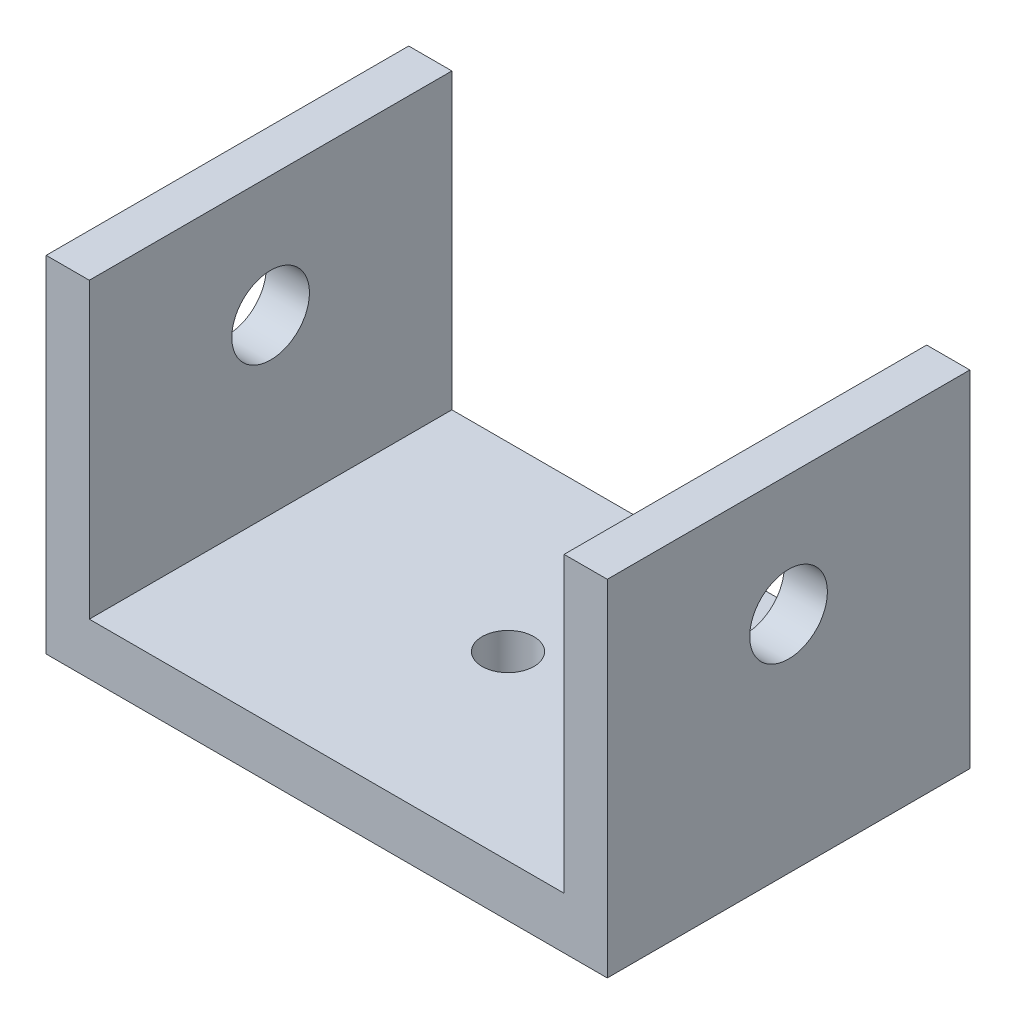
ISO-10303-21;
HEADER;
FILE_DESCRIPTION(('STEP AP214'),'2;1');
FILE_NAME('part.step','',(''),(''),'','','');
FILE_SCHEMA(('AUTOMOTIVE_DESIGN { 1 0 10303 214 1 1 1 1 }'));
ENDSEC;
DATA;
#1=APPLICATION_CONTEXT('core data for automotive mechanical design processes');
#2=APPLICATION_PROTOCOL_DEFINITION('international standard','automotive_design',2000,#1);
#3=PRODUCT_CONTEXT('',#1,'mechanical');
#4=PRODUCT('Part','Part','',(#3));
#5=PRODUCT_RELATED_PRODUCT_CATEGORY('part','',(#4));
#6=PRODUCT_DEFINITION_FORMATION('','',#4);
#7=PRODUCT_DEFINITION_CONTEXT('part definition',#1,'design');
#8=PRODUCT_DEFINITION('design','',#6,#7);
#9=PRODUCT_DEFINITION_SHAPE('','',#8);
#10=(LENGTH_UNIT() NAMED_UNIT(*) SI_UNIT(.MILLI.,.METRE.));
#11=(NAMED_UNIT(*) PLANE_ANGLE_UNIT() SI_UNIT($,.RADIAN.));
#12=(NAMED_UNIT(*) SI_UNIT($,.STERADIAN.) SOLID_ANGLE_UNIT());
#13=UNCERTAINTY_MEASURE_WITH_UNIT(LENGTH_MEASURE(1.E-05),#10,'distance_accuracy_value','');
#14=(GEOMETRIC_REPRESENTATION_CONTEXT(3) GLOBAL_UNCERTAINTY_ASSIGNED_CONTEXT((#13)) GLOBAL_UNIT_ASSIGNED_CONTEXT((#10,
#11,#12)) REPRESENTATION_CONTEXT('',''));
#15=CARTESIAN_POINT('',(0.,0.,0.));
#16=DIRECTION('',(0.,0.,1.));
#17=DIRECTION('',(1.,0.,0.));
#18=AXIS2_PLACEMENT_3D('',#15,#16,#17);
#19=CARTESIAN_POINT('',(0.,3.,-10.5));
#20=DIRECTION('',(0.,0.,-1.));
#21=DIRECTION('',(-1.,0.,0.));
#22=AXIS2_PLACEMENT_3D('',#19,#20,#21);
#23=PLANE('',#22);
#24=DIRECTION('',(1.,0.,0.));
#25=VECTOR('',#24,1.);
#26=CARTESIAN_POINT('',(0.,0.,-10.5));
#27=LINE('',#26,#25);
#28=CARTESIAN_POINT('',(-16.25,0.,-10.5));
#29=VERTEX_POINT('',#28);
#30=CARTESIAN_POINT('',(16.25,0.,-10.5));
#31=VERTEX_POINT('',#30);
#32=EDGE_CURVE('E164',#29,#31,#27,.T.);
#33=ORIENTED_EDGE('',*,*,#32,.F.);
#34=DIRECTION('',(0.,-1.,0.));
#35=VECTOR('',#34,1.);
#36=CARTESIAN_POINT('',(-16.25,20.,-10.5));
#37=LINE('',#36,#35);
#38=CARTESIAN_POINT('',(-16.25,20.,-10.5));
#39=VERTEX_POINT('',#38);
#40=EDGE_CURVE('E161',#39,#29,#37,.T.);
#41=ORIENTED_EDGE('',*,*,#40,.F.);
#42=DIRECTION('',(1.,0.,0.));
#43=VECTOR('',#42,1.);
#44=CARTESIAN_POINT('',(0.,20.,-10.5));
#45=LINE('',#44,#43);
#46=CARTESIAN_POINT('',(-13.75,20.,-10.5));
#47=VERTEX_POINT('',#46);
#48=EDGE_CURVE('E143',#39,#47,#45,.T.);
#49=ORIENTED_EDGE('',*,*,#48,.T.);
#50=DIRECTION('',(0.,-1.,0.));
#51=VECTOR('',#50,1.);
#52=CARTESIAN_POINT('',(-13.75,20.,-10.5));
#53=LINE('',#52,#51);
#54=CARTESIAN_POINT('',(-13.75,3.,-10.5));
#55=VERTEX_POINT('',#54);
#56=EDGE_CURVE('E153',#47,#55,#53,.T.);
#57=ORIENTED_EDGE('',*,*,#56,.T.);
#58=DIRECTION('',(1.,0.,0.));
#59=VECTOR('',#58,1.);
#60=CARTESIAN_POINT('',(0.,3.,-10.5));
#61=LINE('',#60,#59);
#62=CARTESIAN_POINT('',(13.75,3.,-10.5));
#63=VERTEX_POINT('',#62);
#64=EDGE_CURVE('E110',#55,#63,#61,.T.);
#65=ORIENTED_EDGE('',*,*,#64,.T.);
#66=DIRECTION('',(0.,-1.,0.));
#67=VECTOR('',#66,1.);
#68=CARTESIAN_POINT('',(13.75,20.,-10.5));
#69=LINE('',#68,#67);
#70=CARTESIAN_POINT('',(13.75,20.,-10.5));
#71=VERTEX_POINT('',#70);
#72=EDGE_CURVE('E104',#71,#63,#69,.T.);
#73=ORIENTED_EDGE('',*,*,#72,.F.);
#74=DIRECTION('',(1.,0.,0.));
#75=VECTOR('',#74,1.);
#76=CARTESIAN_POINT('',(0.,20.,-10.5));
#77=LINE('',#76,#75);
#78=CARTESIAN_POINT('',(16.25,20.,-10.5));
#79=VERTEX_POINT('',#78);
#80=EDGE_CURVE('E108',#71,#79,#77,.T.);
#81=ORIENTED_EDGE('',*,*,#80,.T.);
#82=DIRECTION('',(0.,-1.,0.));
#83=VECTOR('',#82,1.);
#84=CARTESIAN_POINT('',(16.25,20.,-10.5));
#85=LINE('',#84,#83);
#86=EDGE_CURVE('E136',#79,#31,#85,.T.);
#87=ORIENTED_EDGE('',*,*,#86,.T.);
#88=EDGE_LOOP('',(#33,#41,#49,#57,#65,#73,#81,#87));
#89=FACE_BOUND('',#88,.T.);
#90=ADVANCED_FACE('F37',(#89),#23,.T.);
#91=CARTESIAN_POINT('',(0.,3.,10.5));
#92=DIRECTION('',(0.,0.,-1.));
#93=DIRECTION('',(-1.,0.,0.));
#94=AXIS2_PLACEMENT_3D('',#91,#92,#93);
#95=PLANE('',#94);
#96=DIRECTION('',(1.,0.,0.));
#97=VECTOR('',#96,1.);
#98=CARTESIAN_POINT('',(0.,0.,10.5));
#99=LINE('',#98,#97);
#100=CARTESIAN_POINT('',(-16.25,0.,10.5));
#101=VERTEX_POINT('',#100);
#102=CARTESIAN_POINT('',(16.25,0.,10.5));
#103=VERTEX_POINT('',#102);
#104=EDGE_CURVE('E40',#101,#103,#99,.T.);
#105=ORIENTED_EDGE('',*,*,#104,.T.);
#106=DIRECTION('',(0.,-1.,0.));
#107=VECTOR('',#106,1.);
#108=CARTESIAN_POINT('',(16.25,20.,10.5));
#109=LINE('',#108,#107);
#110=CARTESIAN_POINT('',(16.25,20.,10.5));
#111=VERTEX_POINT('',#110);
#112=EDGE_CURVE('E139',#111,#103,#109,.T.);
#113=ORIENTED_EDGE('',*,*,#112,.F.);
#114=DIRECTION('',(1.,0.,0.));
#115=VECTOR('',#114,1.);
#116=CARTESIAN_POINT('',(0.,20.,10.5));
#117=LINE('',#116,#115);
#118=CARTESIAN_POINT('',(13.75,20.,10.5));
#119=VERTEX_POINT('',#118);
#120=EDGE_CURVE('E121',#119,#111,#117,.T.);
#121=ORIENTED_EDGE('',*,*,#120,.F.);
#122=DIRECTION('',(0.,-1.,0.));
#123=VECTOR('',#122,1.);
#124=CARTESIAN_POINT('',(13.75,20.,10.5));
#125=LINE('',#124,#123);
#126=CARTESIAN_POINT('',(13.75,3.,10.5));
#127=VERTEX_POINT('',#126);
#128=EDGE_CURVE('E113',#119,#127,#125,.T.);
#129=ORIENTED_EDGE('',*,*,#128,.T.);
#130=DIRECTION('',(1.,0.,0.));
#131=VECTOR('',#130,1.);
#132=CARTESIAN_POINT('',(0.,3.,10.5));
#133=LINE('',#132,#131);
#134=CARTESIAN_POINT('',(-13.75,3.,10.5));
#135=VERTEX_POINT('',#134);
#136=EDGE_CURVE('E11',#135,#127,#133,.T.);
#137=ORIENTED_EDGE('',*,*,#136,.F.);
#138=DIRECTION('',(0.,-1.,0.));
#139=VECTOR('',#138,1.);
#140=CARTESIAN_POINT('',(-13.75,20.,10.5));
#141=LINE('',#140,#139);
#142=CARTESIAN_POINT('',(-13.75,20.,10.5));
#143=VERTEX_POINT('',#142);
#144=EDGE_CURVE('E53',#143,#135,#141,.T.);
#145=ORIENTED_EDGE('',*,*,#144,.F.);
#146=DIRECTION('',(1.,0.,0.));
#147=VECTOR('',#146,1.);
#148=CARTESIAN_POINT('',(0.,20.,10.5));
#149=LINE('',#148,#147);
#150=CARTESIAN_POINT('',(-16.25,20.,10.5));
#151=VERTEX_POINT('',#150);
#152=EDGE_CURVE('E149',#151,#143,#149,.T.);
#153=ORIENTED_EDGE('',*,*,#152,.F.);
#154=DIRECTION('',(0.,-1.,0.));
#155=VECTOR('',#154,1.);
#156=CARTESIAN_POINT('',(-16.25,20.,10.5));
#157=LINE('',#156,#155);
#158=EDGE_CURVE('E158',#151,#101,#157,.T.);
#159=ORIENTED_EDGE('',*,*,#158,.T.);
#160=EDGE_LOOP('',(#105,#113,#121,#129,#137,#145,#153,#159));
#161=FACE_BOUND('',#160,.T.);
#162=ADVANCED_FACE('F171',(#161),#95,.F.);
#163=CARTESIAN_POINT('',(0.,3.,0.));
#164=DIRECTION('',(0.,1.,0.));
#165=DIRECTION('',(0.,0.,1.));
#166=AXIS2_PLACEMENT_3D('',#163,#164,#165);
#167=PLANE('',#166);
#168=CARTESIAN_POINT('',(0.,3.,0.));
#169=DIRECTION('',(0.,1.,0.));
#170=DIRECTION('',(0.,0.,1.));
#171=AXIS2_PLACEMENT_3D('',#168,#169,#170);
#172=CIRCLE('',#171,1.5);
#173=CARTESIAN_POINT('',(0.,3.,1.5));
#174=VERTEX_POINT('',#173);
#175=EDGE_CURVE('E310',#174,#174,#172,.T.);
#176=ORIENTED_EDGE('',*,*,#175,.F.);
#177=EDGE_LOOP('',(#176));
#178=FACE_BOUND('',#177,.T.);
#179=DIRECTION('',(0.,0.,1.));
#180=VECTOR('',#179,1.);
#181=CARTESIAN_POINT('',(13.75,3.,0.));
#182=LINE('',#181,#180);
#183=EDGE_CURVE('E60',#63,#127,#182,.T.);
#184=ORIENTED_EDGE('',*,*,#183,.F.);
#185=ORIENTED_EDGE('',*,*,#64,.F.);
#186=DIRECTION('',(0.,0.,1.));
#187=VECTOR('',#186,1.);
#188=CARTESIAN_POINT('',(-13.75,3.,0.));
#189=LINE('',#188,#187);
#190=EDGE_CURVE('E45',#55,#135,#189,.T.);
#191=ORIENTED_EDGE('',*,*,#190,.T.);
#192=ORIENTED_EDGE('',*,*,#136,.T.);
#193=EDGE_LOOP('',(#184,#185,#191,#192));
#194=FACE_BOUND('',#193,.T.);
#195=ADVANCED_FACE('F179',(#178,#194),#167,.T.);
#196=CARTESIAN_POINT('',(0.,0.,0.));
#197=DIRECTION('',(0.,1.,0.));
#198=DIRECTION('',(0.,0.,1.));
#199=AXIS2_PLACEMENT_3D('',#196,#197,#198);
#200=PLANE('',#199);
#201=CARTESIAN_POINT('',(0.,0.,0.));
#202=DIRECTION('',(0.,1.,0.));
#203=DIRECTION('',(0.,0.,1.));
#204=AXIS2_PLACEMENT_3D('',#201,#202,#203);
#205=CIRCLE('',#204,1.5);
#206=CARTESIAN_POINT('',(0.,0.,1.5));
#207=VERTEX_POINT('',#206);
#208=EDGE_CURVE('E307',#207,#207,#205,.T.);
#209=ORIENTED_EDGE('',*,*,#208,.T.);
#210=EDGE_LOOP('',(#209));
#211=FACE_BOUND('',#210,.T.);
#212=ORIENTED_EDGE('',*,*,#32,.T.);
#213=DIRECTION('',(0.,0.,-1.));
#214=VECTOR('',#213,1.);
#215=CARTESIAN_POINT('',(16.25,0.,0.));
#216=LINE('',#215,#214);
#217=EDGE_CURVE('E127',#103,#31,#216,.T.);
#218=ORIENTED_EDGE('',*,*,#217,.F.);
#219=ORIENTED_EDGE('',*,*,#104,.F.);
#220=DIRECTION('',(0.,0.,-1.));
#221=VECTOR('',#220,1.);
#222=CARTESIAN_POINT('',(-16.25,0.,0.));
#223=LINE('',#222,#221);
#224=EDGE_CURVE('E112',#101,#29,#223,.T.);
#225=ORIENTED_EDGE('',*,*,#224,.T.);
#226=EDGE_LOOP('',(#212,#218,#219,#225));
#227=FACE_BOUND('',#226,.T.);
#228=ADVANCED_FACE('F176',(#211,#227),#200,.F.);
#229=CARTESIAN_POINT('',(-13.75,20.,0.));
#230=DIRECTION('',(1.,0.,0.));
#231=DIRECTION('',(0.,0.,-1.));
#232=AXIS2_PLACEMENT_3D('',#229,#230,#231);
#233=PLANE('',#232);
#234=CARTESIAN_POINT('',(-13.75,13.,0.));
#235=DIRECTION('',(1.,0.,0.));
#236=DIRECTION('',(0.,0.,-1.));
#237=AXIS2_PLACEMENT_3D('',#234,#235,#236);
#238=CIRCLE('',#237,2.25);
#239=CARTESIAN_POINT('',(-13.75,13.,-2.25));
#240=VERTEX_POINT('',#239);
#241=EDGE_CURVE('E130',#240,#240,#238,.T.);
#242=ORIENTED_EDGE('',*,*,#241,.F.);
#243=EDGE_LOOP('',(#242));
#244=FACE_BOUND('',#243,.T.);
#245=ORIENTED_EDGE('',*,*,#190,.F.);
#246=ORIENTED_EDGE('',*,*,#56,.F.);
#247=DIRECTION('',(0.,0.,1.));
#248=VECTOR('',#247,1.);
#249=CARTESIAN_POINT('',(-13.75,20.,0.));
#250=LINE('',#249,#248);
#251=EDGE_CURVE('E151',#47,#143,#250,.T.);
#252=ORIENTED_EDGE('',*,*,#251,.T.);
#253=ORIENTED_EDGE('',*,*,#144,.T.);
#254=EDGE_LOOP('',(#245,#246,#252,#253));
#255=FACE_BOUND('',#254,.T.);
#256=ADVANCED_FACE('F178',(#244,#255),#233,.T.);
#257=CARTESIAN_POINT('',(-16.25,20.,0.));
#258=DIRECTION('',(-1.,0.,0.));
#259=DIRECTION('',(0.,0.,1.));
#260=AXIS2_PLACEMENT_3D('',#257,#258,#259);
#261=PLANE('',#260);
#262=CARTESIAN_POINT('',(-16.25,13.,0.));
#263=DIRECTION('',(1.,0.,0.));
#264=DIRECTION('',(0.,0.,-1.));
#265=AXIS2_PLACEMENT_3D('',#262,#263,#264);
#266=CIRCLE('',#265,2.25);
#267=CARTESIAN_POINT('',(-16.25,13.,-2.25));
#268=VERTEX_POINT('',#267);
#269=EDGE_CURVE('E296',#268,#268,#266,.T.);
#270=ORIENTED_EDGE('',*,*,#269,.T.);
#271=EDGE_LOOP('',(#270));
#272=FACE_BOUND('',#271,.T.);
#273=ORIENTED_EDGE('',*,*,#224,.F.);
#274=ORIENTED_EDGE('',*,*,#158,.F.);
#275=DIRECTION('',(0.,0.,-1.));
#276=VECTOR('',#275,1.);
#277=CARTESIAN_POINT('',(-16.25,20.,0.));
#278=LINE('',#277,#276);
#279=EDGE_CURVE('E146',#151,#39,#278,.T.);
#280=ORIENTED_EDGE('',*,*,#279,.T.);
#281=ORIENTED_EDGE('',*,*,#40,.T.);
#282=EDGE_LOOP('',(#273,#274,#280,#281));
#283=FACE_BOUND('',#282,.T.);
#284=ADVANCED_FACE('F186',(#272,#283),#261,.T.);
#285=CARTESIAN_POINT('',(0.,20.,0.));
#286=DIRECTION('',(0.,1.,0.));
#287=DIRECTION('',(0.,0.,1.));
#288=AXIS2_PLACEMENT_3D('',#285,#286,#287);
#289=PLANE('',#288);
#290=ORIENTED_EDGE('',*,*,#48,.F.);
#291=ORIENTED_EDGE('',*,*,#279,.F.);
#292=ORIENTED_EDGE('',*,*,#152,.T.);
#293=ORIENTED_EDGE('',*,*,#251,.F.);
#294=EDGE_LOOP('',(#290,#291,#292,#293));
#295=FACE_BOUND('',#294,.T.);
#296=ADVANCED_FACE('F258',(#295),#289,.T.);
#297=CARTESIAN_POINT('',(13.75,20.,0.));
#298=DIRECTION('',(1.,0.,0.));
#299=DIRECTION('',(0.,0.,-1.));
#300=AXIS2_PLACEMENT_3D('',#297,#298,#299);
#301=PLANE('',#300);
#302=CARTESIAN_POINT('',(13.75,13.,0.));
#303=DIRECTION('',(1.,0.,0.));
#304=DIRECTION('',(0.,0.,-1.));
#305=AXIS2_PLACEMENT_3D('',#302,#303,#304);
#306=CIRCLE('',#305,2.25);
#307=CARTESIAN_POINT('',(13.75,13.,-2.25));
#308=VERTEX_POINT('',#307);
#309=EDGE_CURVE('E302',#308,#308,#306,.T.);
#310=ORIENTED_EDGE('',*,*,#309,.T.);
#311=EDGE_LOOP('',(#310));
#312=FACE_BOUND('',#311,.T.);
#313=ORIENTED_EDGE('',*,*,#72,.T.);
#314=ORIENTED_EDGE('',*,*,#183,.T.);
#315=ORIENTED_EDGE('',*,*,#128,.F.);
#316=DIRECTION('',(0.,0.,1.));
#317=VECTOR('',#316,1.);
#318=CARTESIAN_POINT('',(13.75,20.,0.));
#319=LINE('',#318,#317);
#320=EDGE_CURVE('E116',#71,#119,#319,.T.);
#321=ORIENTED_EDGE('',*,*,#320,.F.);
#322=EDGE_LOOP('',(#313,#314,#315,#321));
#323=FACE_BOUND('',#322,.T.);
#324=ADVANCED_FACE('F117',(#312,#323),#301,.F.);
#325=CARTESIAN_POINT('',(16.25,20.,0.));
#326=DIRECTION('',(-1.,0.,0.));
#327=DIRECTION('',(0.,0.,1.));
#328=AXIS2_PLACEMENT_3D('',#325,#326,#327);
#329=PLANE('',#328);
#330=CARTESIAN_POINT('',(16.25,13.,0.));
#331=DIRECTION('',(1.,0.,0.));
#332=DIRECTION('',(0.,0.,-1.));
#333=AXIS2_PLACEMENT_3D('',#330,#331,#332);
#334=CIRCLE('',#333,2.25);
#335=CARTESIAN_POINT('',(16.25,13.,-2.25));
#336=VERTEX_POINT('',#335);
#337=EDGE_CURVE('E303',#336,#336,#334,.T.);
#338=ORIENTED_EDGE('',*,*,#337,.F.);
#339=EDGE_LOOP('',(#338));
#340=FACE_BOUND('',#339,.T.);
#341=ORIENTED_EDGE('',*,*,#217,.T.);
#342=ORIENTED_EDGE('',*,*,#86,.F.);
#343=DIRECTION('',(0.,0.,-1.));
#344=VECTOR('',#343,1.);
#345=CARTESIAN_POINT('',(16.25,20.,0.));
#346=LINE('',#345,#344);
#347=EDGE_CURVE('E125',#111,#79,#346,.T.);
#348=ORIENTED_EDGE('',*,*,#347,.F.);
#349=ORIENTED_EDGE('',*,*,#112,.T.);
#350=EDGE_LOOP('',(#341,#342,#348,#349));
#351=FACE_BOUND('',#350,.T.);
#352=ADVANCED_FACE('F175',(#340,#351),#329,.F.);
#353=CARTESIAN_POINT('',(0.,20.,0.));
#354=DIRECTION('',(0.,1.,0.));
#355=DIRECTION('',(0.,0.,1.));
#356=AXIS2_PLACEMENT_3D('',#353,#354,#355);
#357=PLANE('',#356);
#358=ORIENTED_EDGE('',*,*,#80,.F.);
#359=ORIENTED_EDGE('',*,*,#320,.T.);
#360=ORIENTED_EDGE('',*,*,#120,.T.);
#361=ORIENTED_EDGE('',*,*,#347,.T.);
#362=EDGE_LOOP('',(#358,#359,#360,#361));
#363=FACE_BOUND('',#362,.T.);
#364=ADVANCED_FACE('F123',(#363),#357,.T.);
#365=CARTESIAN_POINT('',(-16.25,13.,0.));
#366=DIRECTION('',(1.,0.,0.));
#367=DIRECTION('',(0.,0.,-1.));
#368=AXIS2_PLACEMENT_3D('',#365,#366,#367);
#369=CYLINDRICAL_SURFACE('',#368,2.25);
#370=ORIENTED_EDGE('',*,*,#337,.T.);
#371=EDGE_LOOP('',(#370));
#372=FACE_BOUND('',#371,.T.);
#373=ORIENTED_EDGE('',*,*,#309,.F.);
#374=EDGE_LOOP('',(#373));
#375=FACE_BOUND('',#374,.T.);
#376=ADVANCED_FACE('F233',(#372,#375),#369,.F.);
#377=ORIENTED_EDGE('',*,*,#241,.T.);
#378=EDGE_LOOP('',(#377));
#379=FACE_BOUND('',#378,.T.);
#380=ORIENTED_EDGE('',*,*,#269,.F.);
#381=EDGE_LOOP('',(#380));
#382=FACE_BOUND('',#381,.T.);
#383=ADVANCED_FACE('F210',(#379,#382),#369,.F.);
#384=CARTESIAN_POINT('',(0.,0.,0.));
#385=DIRECTION('',(0.,1.,0.));
#386=DIRECTION('',(0.,0.,1.));
#387=AXIS2_PLACEMENT_3D('',#384,#385,#386);
#388=CYLINDRICAL_SURFACE('',#387,1.5);
#389=ORIENTED_EDGE('',*,*,#208,.F.);
#390=EDGE_LOOP('',(#389));
#391=FACE_BOUND('',#390,.T.);
#392=ORIENTED_EDGE('',*,*,#175,.T.);
#393=EDGE_LOOP('',(#392));
#394=FACE_BOUND('',#393,.T.);
#395=ADVANCED_FACE('F222',(#391,#394),#388,.F.);
#396=CLOSED_SHELL('',(#90,#162,#195,#228,#256,#284,#296,#324,#352,#364,#376,#383,#395));
#397=MANIFOLD_SOLID_BREP('B2',#396);
#398=ADVANCED_BREP_SHAPE_REPRESENTATION('',(#18,#397),#14);
#399=SHAPE_DEFINITION_REPRESENTATION(#9,#398);
ENDSEC;
END-ISO-10303-21;
